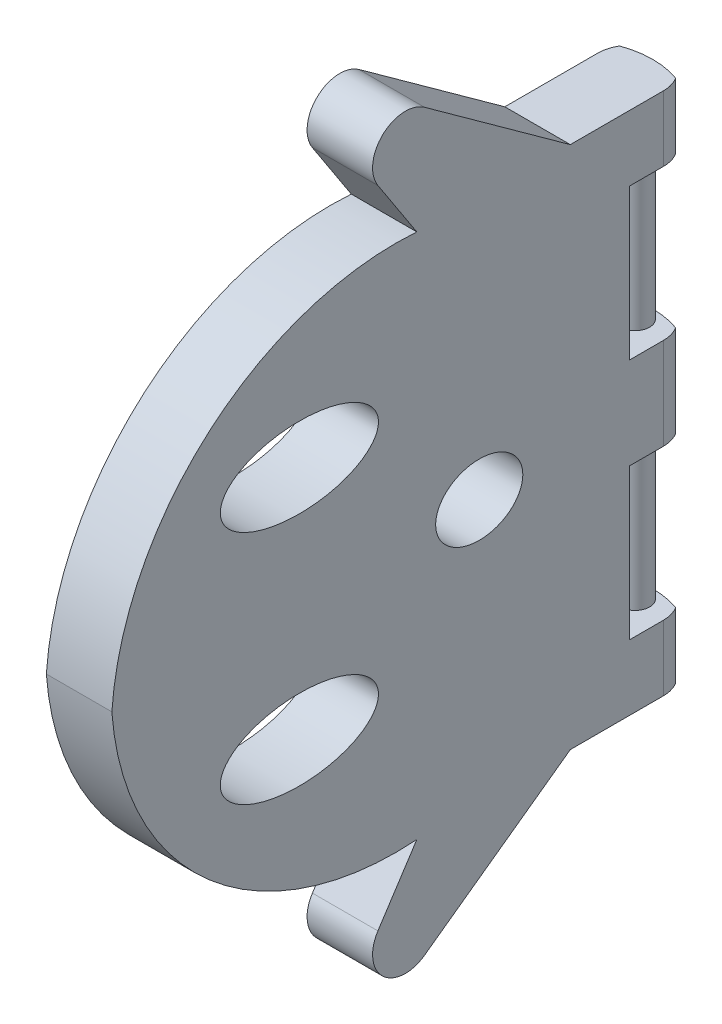
ISO-10303-21;
HEADER;
FILE_DESCRIPTION(('STEP AP214'),'2;1');
FILE_NAME('part.step','',(''),(''),'','','');
FILE_SCHEMA(('AUTOMOTIVE_DESIGN { 1 0 10303 214 1 1 1 1 }'));
ENDSEC;
DATA;
#1=APPLICATION_CONTEXT('core data for automotive mechanical design processes');
#2=APPLICATION_PROTOCOL_DEFINITION('international standard','automotive_design',2000,#1);
#3=PRODUCT_CONTEXT('',#1,'mechanical');
#4=PRODUCT('Part','Part','',(#3));
#5=PRODUCT_RELATED_PRODUCT_CATEGORY('part','',(#4));
#6=PRODUCT_DEFINITION_FORMATION('','',#4);
#7=PRODUCT_DEFINITION_CONTEXT('part definition',#1,'design');
#8=PRODUCT_DEFINITION('design','',#6,#7);
#9=PRODUCT_DEFINITION_SHAPE('','',#8);
#10=(LENGTH_UNIT() NAMED_UNIT(*) SI_UNIT(.MILLI.,.METRE.));
#11=(NAMED_UNIT(*) PLANE_ANGLE_UNIT() SI_UNIT($,.RADIAN.));
#12=(NAMED_UNIT(*) SI_UNIT($,.STERADIAN.) SOLID_ANGLE_UNIT());
#13=UNCERTAINTY_MEASURE_WITH_UNIT(LENGTH_MEASURE(1.E-05),#10,'distance_accuracy_value','');
#14=(GEOMETRIC_REPRESENTATION_CONTEXT(3) GLOBAL_UNCERTAINTY_ASSIGNED_CONTEXT((#13)) GLOBAL_UNIT_ASSIGNED_CONTEXT((#10,
#11,#12)) REPRESENTATION_CONTEXT('',''));
#15=CARTESIAN_POINT('',(0.,0.,0.));
#16=DIRECTION('',(0.,0.,1.));
#17=DIRECTION('',(1.,0.,0.));
#18=AXIS2_PLACEMENT_3D('',#15,#16,#17);
#19=CARTESIAN_POINT('',(5.,20.,-10.));
#20=DIRECTION('',(0.,-1.,0.));
#21=DIRECTION('',(0.,0.,-1.));
#22=AXIS2_PLACEMENT_3D('',#19,#20,#21);
#23=PLANE('',#22);
#24=CARTESIAN_POINT('',(2.5,20.,-7.10203344815805));
#25=DIRECTION('',(0.,-1.,0.));
#26=DIRECTION('',(0.,0.,-1.));
#27=AXIS2_PLACEMENT_3D('',#24,#25,#26);
#28=CIRCLE('',#27,2.5);
#29=CARTESIAN_POINT('',(5.,20.,-7.10203344815805));
#30=VERTEX_POINT('',#29);
#31=CARTESIAN_POINT('',(4.62958142106939,20.,-8.4115688509006));
#32=VERTEX_POINT('',#31);
#33=EDGE_CURVE('E483',#30,#32,#28,.F.);
#34=ORIENTED_EDGE('',*,*,#33,.T.);
#35=CARTESIAN_POINT('',(2.5112638236308,20.,-2.53424752647545));
#36=DIRECTION('',(0.,-1.,0.));
#37=DIRECTION('',(0.,0.,-1.));
#38=AXIS2_PLACEMENT_3D('',#35,#36,#37);
#39=CIRCLE('',#38,6.24741349633275);
#40=CARTESIAN_POINT('',(0.363986081439822,20.,-8.40105020698651));
#41=VERTEX_POINT('',#40);
#42=EDGE_CURVE('E267',#32,#41,#39,.F.);
#43=ORIENTED_EDGE('',*,*,#42,.T.);
#44=CARTESIAN_POINT('',(2.5,20.,-7.10203344815805));
#45=DIRECTION('',(0.,-1.,0.));
#46=DIRECTION('',(0.,0.,-1.));
#47=AXIS2_PLACEMENT_3D('',#44,#45,#46);
#48=CIRCLE('',#47,2.5);
#49=CARTESIAN_POINT('',(0.,20.,-7.10203344815805));
#50=VERTEX_POINT('',#49);
#51=EDGE_CURVE('E487',#41,#50,#48,.F.);
#52=ORIENTED_EDGE('',*,*,#51,.T.);
#53=DIRECTION('',(0.,0.,1.));
#54=VECTOR('',#53,1.);
#55=CARTESIAN_POINT('',(0.,20.,-10.));
#56=LINE('',#55,#54);
#57=CARTESIAN_POINT('',(0.,20.,0.));
#58=VERTEX_POINT('',#57);
#59=EDGE_CURVE('E311',#50,#58,#56,.T.);
#60=ORIENTED_EDGE('',*,*,#59,.T.);
#61=DIRECTION('',(-1.,0.,0.));
#62=VECTOR('',#61,1.);
#63=CARTESIAN_POINT('',(5.,20.,0.));
#64=LINE('',#63,#62);
#65=CARTESIAN_POINT('',(5.,20.,0.));
#66=VERTEX_POINT('',#65);
#67=EDGE_CURVE('E463',#66,#58,#64,.T.);
#68=ORIENTED_EDGE('',*,*,#67,.F.);
#69=DIRECTION('',(0.,0.,1.));
#70=VECTOR('',#69,1.);
#71=CARTESIAN_POINT('',(5.,20.,-10.));
#72=LINE('',#71,#70);
#73=EDGE_CURVE('E314',#30,#66,#72,.T.);
#74=ORIENTED_EDGE('',*,*,#73,.F.);
#75=EDGE_LOOP('',(#34,#43,#52,#60,#68,#74));
#76=FACE_BOUND('',#75,.T.);
#77=ADVANCED_FACE('F44',(#76),#23,.F.);
#78=CARTESIAN_POINT('',(5.,-20.,0.));
#79=DIRECTION('',(0.,1.,0.));
#80=DIRECTION('',(0.,0.,1.));
#81=AXIS2_PLACEMENT_3D('',#78,#79,#80);
#82=PLANE('',#81);
#83=CARTESIAN_POINT('',(2.5,-20.,-7.10203344815805));
#84=DIRECTION('',(0.,1.,0.));
#85=DIRECTION('',(0.,0.,1.));
#86=AXIS2_PLACEMENT_3D('',#83,#84,#85);
#87=CIRCLE('',#86,2.5);
#88=CARTESIAN_POINT('',(0.,-20.,-7.10203344815805));
#89=VERTEX_POINT('',#88);
#90=CARTESIAN_POINT('',(0.363986081439822,-20.,-8.40105020698651));
#91=VERTEX_POINT('',#90);
#92=EDGE_CURVE('E519',#89,#91,#87,.F.);
#93=ORIENTED_EDGE('',*,*,#92,.T.);
#94=CARTESIAN_POINT('',(2.5112638236308,-20.,-2.53424752647545));
#95=DIRECTION('',(0.,1.,0.));
#96=DIRECTION('',(0.,0.,1.));
#97=AXIS2_PLACEMENT_3D('',#94,#95,#96);
#98=CIRCLE('',#97,6.24741349633275);
#99=CARTESIAN_POINT('',(4.62958142106939,-20.,-8.4115688509006));
#100=VERTEX_POINT('',#99);
#101=EDGE_CURVE('E232',#91,#100,#98,.F.);
#102=ORIENTED_EDGE('',*,*,#101,.T.);
#103=CARTESIAN_POINT('',(2.5,-20.,-7.10203344815805));
#104=DIRECTION('',(0.,1.,0.));
#105=DIRECTION('',(0.,0.,1.));
#106=AXIS2_PLACEMENT_3D('',#103,#104,#105);
#107=CIRCLE('',#106,2.5);
#108=CARTESIAN_POINT('',(5.,-20.,-7.10203344815805));
#109=VERTEX_POINT('',#108);
#110=EDGE_CURVE('E514',#100,#109,#107,.F.);
#111=ORIENTED_EDGE('',*,*,#110,.T.);
#112=DIRECTION('',(0.,0.,-1.));
#113=VECTOR('',#112,1.);
#114=CARTESIAN_POINT('',(5.,-20.,0.));
#115=LINE('',#114,#113);
#116=CARTESIAN_POINT('',(5.,-20.,0.));
#117=VERTEX_POINT('',#116);
#118=EDGE_CURVE('E345',#117,#109,#115,.T.);
#119=ORIENTED_EDGE('',*,*,#118,.F.);
#120=DIRECTION('',(-1.,0.,0.));
#121=VECTOR('',#120,1.);
#122=CARTESIAN_POINT('',(5.,-20.,0.));
#123=LINE('',#122,#121);
#124=CARTESIAN_POINT('',(0.,-20.,0.));
#125=VERTEX_POINT('',#124);
#126=EDGE_CURVE('E435',#117,#125,#123,.T.);
#127=ORIENTED_EDGE('',*,*,#126,.T.);
#128=DIRECTION('',(0.,0.,-1.));
#129=VECTOR('',#128,1.);
#130=CARTESIAN_POINT('',(0.,-20.,0.));
#131=LINE('',#130,#129);
#132=EDGE_CURVE('E395',#125,#89,#131,.T.);
#133=ORIENTED_EDGE('',*,*,#132,.T.);
#134=EDGE_LOOP('',(#93,#102,#111,#119,#127,#133));
#135=FACE_BOUND('',#134,.T.);
#136=ADVANCED_FACE('F537',(#135),#82,.F.);
#137=CARTESIAN_POINT('',(5.,-15.,-4.5));
#138=DIRECTION('',(0.,-1.,0.));
#139=DIRECTION('',(0.,0.,-1.));
#140=AXIS2_PLACEMENT_3D('',#137,#138,#139);
#141=PLANE('',#140);
#142=CARTESIAN_POINT('',(2.5,-15.,-7.45));
#143=DIRECTION('',(0.,-1.,0.));
#144=DIRECTION('',(0.,0.,-1.));
#145=AXIS2_PLACEMENT_3D('',#142,#143,#144);
#146=CIRCLE('',#145,1.1);
#147=CARTESIAN_POINT('',(2.5,-15.,-8.55));
#148=VERTEX_POINT('',#147);
#149=EDGE_CURVE('E53',#148,#148,#146,.F.);
#150=ORIENTED_EDGE('',*,*,#149,.F.);
#151=EDGE_LOOP('',(#150));
#152=FACE_BOUND('',#151,.T.);
#153=CARTESIAN_POINT('',(2.5,-15.,-7.10203344815805));
#154=DIRECTION('',(0.,-1.,0.));
#155=DIRECTION('',(0.,0.,-1.));
#156=AXIS2_PLACEMENT_3D('',#153,#154,#155);
#157=CIRCLE('',#156,2.5);
#158=CARTESIAN_POINT('',(5.,-15.,-7.10203344815805));
#159=VERTEX_POINT('',#158);
#160=CARTESIAN_POINT('',(4.62958142106939,-15.,-8.4115688509006));
#161=VERTEX_POINT('',#160);
#162=EDGE_CURVE('E223',#159,#161,#157,.F.);
#163=ORIENTED_EDGE('',*,*,#162,.T.);
#164=CARTESIAN_POINT('',(2.5112638236308,-15.,-2.53424752647545));
#165=DIRECTION('',(0.,-1.,0.));
#166=DIRECTION('',(0.,0.,-1.));
#167=AXIS2_PLACEMENT_3D('',#164,#165,#166);
#168=CIRCLE('',#167,6.24741349633275);
#169=CARTESIAN_POINT('',(0.363986081439822,-15.,-8.40105020698651));
#170=VERTEX_POINT('',#169);
#171=EDGE_CURVE('E226',#161,#170,#168,.F.);
#172=ORIENTED_EDGE('',*,*,#171,.T.);
#173=CARTESIAN_POINT('',(2.5,-15.,-7.10203344815805));
#174=DIRECTION('',(0.,-1.,0.));
#175=DIRECTION('',(0.,0.,-1.));
#176=AXIS2_PLACEMENT_3D('',#173,#174,#175);
#177=CIRCLE('',#176,2.5);
#178=CARTESIAN_POINT('',(0.,-15.,-7.10203344815805));
#179=VERTEX_POINT('',#178);
#180=EDGE_CURVE('E213',#170,#179,#177,.F.);
#181=ORIENTED_EDGE('',*,*,#180,.T.);
#182=DIRECTION('',(0.,0.,1.));
#183=VECTOR('',#182,1.);
#184=CARTESIAN_POINT('',(0.,-15.,-4.5));
#185=LINE('',#184,#183);
#186=CARTESIAN_POINT('',(0.,-15.,-4.5));
#187=VERTEX_POINT('',#186);
#188=EDGE_CURVE('E397',#179,#187,#185,.T.);
#189=ORIENTED_EDGE('',*,*,#188,.T.);
#190=DIRECTION('',(-1.,0.,0.));
#191=VECTOR('',#190,1.);
#192=CARTESIAN_POINT('',(5.,-15.,-4.5));
#193=LINE('',#192,#191);
#194=CARTESIAN_POINT('',(5.,-15.,-4.5));
#195=VERTEX_POINT('',#194);
#196=EDGE_CURVE('E426',#195,#187,#193,.T.);
#197=ORIENTED_EDGE('',*,*,#196,.F.);
#198=DIRECTION('',(0.,0.,1.));
#199=VECTOR('',#198,1.);
#200=CARTESIAN_POINT('',(5.,-15.,-4.5));
#201=LINE('',#200,#199);
#202=EDGE_CURVE('E349',#159,#195,#201,.T.);
#203=ORIENTED_EDGE('',*,*,#202,.F.);
#204=EDGE_LOOP('',(#163,#172,#181,#189,#197,#203));
#205=FACE_BOUND('',#204,.T.);
#206=ADVANCED_FACE('F230',(#152,#205),#141,.F.);
#207=CARTESIAN_POINT('',(5.,-3.5,-4.5));
#208=DIRECTION('',(0.,1.,0.));
#209=DIRECTION('',(0.,0.,1.));
#210=AXIS2_PLACEMENT_3D('',#207,#208,#209);
#211=PLANE('',#210);
#212=CARTESIAN_POINT('',(2.5,-3.5,-7.45));
#213=DIRECTION('',(0.,1.,0.));
#214=DIRECTION('',(0.,0.,1.));
#215=AXIS2_PLACEMENT_3D('',#212,#213,#214);
#216=CIRCLE('',#215,1.1);
#217=CARTESIAN_POINT('',(2.5,-3.5,-6.35));
#218=VERTEX_POINT('',#217);
#219=EDGE_CURVE('E527',#218,#218,#216,.F.);
#220=ORIENTED_EDGE('',*,*,#219,.F.);
#221=EDGE_LOOP('',(#220));
#222=FACE_BOUND('',#221,.T.);
#223=CARTESIAN_POINT('',(2.5,-3.5,-7.10203344815805));
#224=DIRECTION('',(0.,1.,0.));
#225=DIRECTION('',(0.,0.,1.));
#226=AXIS2_PLACEMENT_3D('',#223,#224,#225);
#227=CIRCLE('',#226,2.5);
#228=CARTESIAN_POINT('',(0.,-3.5,-7.10203344815805));
#229=VERTEX_POINT('',#228);
#230=CARTESIAN_POINT('',(0.363986081439822,-3.5,-8.40105020698651));
#231=VERTEX_POINT('',#230);
#232=EDGE_CURVE('E505',#229,#231,#227,.F.);
#233=ORIENTED_EDGE('',*,*,#232,.T.);
#234=CARTESIAN_POINT('',(2.5112638236308,-3.5,-2.53424752647545));
#235=DIRECTION('',(0.,1.,0.));
#236=DIRECTION('',(0.,0.,1.));
#237=AXIS2_PLACEMENT_3D('',#234,#235,#236);
#238=CIRCLE('',#237,6.24741349633275);
#239=CARTESIAN_POINT('',(4.62958142106939,-3.5,-8.4115688509006));
#240=VERTEX_POINT('',#239);
#241=EDGE_CURVE('E253',#231,#240,#238,.F.);
#242=ORIENTED_EDGE('',*,*,#241,.T.);
#243=CARTESIAN_POINT('',(2.5,-3.5,-7.10203344815805));
#244=DIRECTION('',(0.,1.,0.));
#245=DIRECTION('',(0.,0.,1.));
#246=AXIS2_PLACEMENT_3D('',#243,#244,#245);
#247=CIRCLE('',#246,2.5);
#248=CARTESIAN_POINT('',(5.,-3.5,-7.10203344815805));
#249=VERTEX_POINT('',#248);
#250=EDGE_CURVE('E497',#240,#249,#247,.F.);
#251=ORIENTED_EDGE('',*,*,#250,.T.);
#252=DIRECTION('',(0.,0.,-1.));
#253=VECTOR('',#252,1.);
#254=CARTESIAN_POINT('',(5.,-3.5,-4.5));
#255=LINE('',#254,#253);
#256=CARTESIAN_POINT('',(5.,-3.5,-4.5));
#257=VERTEX_POINT('',#256);
#258=EDGE_CURVE('E352',#257,#249,#255,.T.);
#259=ORIENTED_EDGE('',*,*,#258,.F.);
#260=DIRECTION('',(-1.,0.,0.));
#261=VECTOR('',#260,1.);
#262=CARTESIAN_POINT('',(5.,-3.5,-4.5));
#263=LINE('',#262,#261);
#264=CARTESIAN_POINT('',(0.,-3.5,-4.5));
#265=VERTEX_POINT('',#264);
#266=EDGE_CURVE('E425',#257,#265,#263,.T.);
#267=ORIENTED_EDGE('',*,*,#266,.T.);
#268=DIRECTION('',(0.,0.,-1.));
#269=VECTOR('',#268,1.);
#270=CARTESIAN_POINT('',(0.,-3.5,-4.5));
#271=LINE('',#270,#269);
#272=EDGE_CURVE('E404',#265,#229,#271,.T.);
#273=ORIENTED_EDGE('',*,*,#272,.T.);
#274=EDGE_LOOP('',(#233,#242,#251,#259,#267,#273));
#275=FACE_BOUND('',#274,.T.);
#276=ADVANCED_FACE('F538',(#222,#275),#211,.F.);
#277=CARTESIAN_POINT('',(5.,3.5,-10.));
#278=DIRECTION('',(0.,-1.,0.));
#279=DIRECTION('',(0.,0.,-1.));
#280=AXIS2_PLACEMENT_3D('',#277,#278,#279);
#281=PLANE('',#280);
#282=CARTESIAN_POINT('',(2.5,3.5,-7.45));
#283=DIRECTION('',(0.,-1.,0.));
#284=DIRECTION('',(0.,0.,-1.));
#285=AXIS2_PLACEMENT_3D('',#282,#283,#284);
#286=CIRCLE('',#285,1.1);
#287=CARTESIAN_POINT('',(2.5,3.5,-8.55));
#288=VERTEX_POINT('',#287);
#289=EDGE_CURVE('E525',#288,#288,#286,.F.);
#290=ORIENTED_EDGE('',*,*,#289,.F.);
#291=EDGE_LOOP('',(#290));
#292=FACE_BOUND('',#291,.T.);
#293=CARTESIAN_POINT('',(2.5,3.5,-7.10203344815805));
#294=DIRECTION('',(0.,-1.,0.));
#295=DIRECTION('',(0.,0.,-1.));
#296=AXIS2_PLACEMENT_3D('',#293,#294,#295);
#297=CIRCLE('',#296,2.5);
#298=CARTESIAN_POINT('',(5.,3.5,-7.10203344815805));
#299=VERTEX_POINT('',#298);
#300=CARTESIAN_POINT('',(4.62958142106939,3.5,-8.4115688509006));
#301=VERTEX_POINT('',#300);
#302=EDGE_CURVE('E506',#299,#301,#297,.F.);
#303=ORIENTED_EDGE('',*,*,#302,.T.);
#304=CARTESIAN_POINT('',(2.5112638236308,3.5,-2.53424752647545));
#305=DIRECTION('',(0.,-1.,0.));
#306=DIRECTION('',(0.,0.,-1.));
#307=AXIS2_PLACEMENT_3D('',#304,#305,#306);
#308=CIRCLE('',#307,6.24741349633275);
#309=CARTESIAN_POINT('',(0.363986081439822,3.5,-8.40105020698651));
#310=VERTEX_POINT('',#309);
#311=EDGE_CURVE('E252',#301,#310,#308,.F.);
#312=ORIENTED_EDGE('',*,*,#311,.T.);
#313=CARTESIAN_POINT('',(2.5,3.5,-7.10203344815805));
#314=DIRECTION('',(0.,-1.,0.));
#315=DIRECTION('',(0.,0.,-1.));
#316=AXIS2_PLACEMENT_3D('',#313,#314,#315);
#317=CIRCLE('',#316,2.5);
#318=CARTESIAN_POINT('',(0.,3.5,-7.10203344815805));
#319=VERTEX_POINT('',#318);
#320=EDGE_CURVE('E509',#310,#319,#317,.F.);
#321=ORIENTED_EDGE('',*,*,#320,.T.);
#322=DIRECTION('',(0.,0.,1.));
#323=VECTOR('',#322,1.);
#324=CARTESIAN_POINT('',(0.,3.5,-10.));
#325=LINE('',#324,#323);
#326=CARTESIAN_POINT('',(0.,3.5,-4.5));
#327=VERTEX_POINT('',#326);
#328=EDGE_CURVE('E410',#319,#327,#325,.T.);
#329=ORIENTED_EDGE('',*,*,#328,.T.);
#330=DIRECTION('',(-1.,0.,0.));
#331=VECTOR('',#330,1.);
#332=CARTESIAN_POINT('',(5.,3.5,-4.5));
#333=LINE('',#332,#331);
#334=CARTESIAN_POINT('',(5.,3.5,-4.5));
#335=VERTEX_POINT('',#334);
#336=EDGE_CURVE('E419',#335,#327,#333,.T.);
#337=ORIENTED_EDGE('',*,*,#336,.F.);
#338=DIRECTION('',(0.,0.,1.));
#339=VECTOR('',#338,1.);
#340=CARTESIAN_POINT('',(5.,3.5,-10.));
#341=LINE('',#340,#339);
#342=EDGE_CURVE('E357',#299,#335,#341,.T.);
#343=ORIENTED_EDGE('',*,*,#342,.F.);
#344=EDGE_LOOP('',(#303,#312,#321,#329,#337,#343));
#345=FACE_BOUND('',#344,.T.);
#346=ADVANCED_FACE('F546',(#292,#345),#281,.F.);
#347=CARTESIAN_POINT('',(5.,15.,-4.5));
#348=DIRECTION('',(0.,1.,0.));
#349=DIRECTION('',(0.,0.,1.));
#350=AXIS2_PLACEMENT_3D('',#347,#348,#349);
#351=PLANE('',#350);
#352=CARTESIAN_POINT('',(2.5,15.,-7.45));
#353=DIRECTION('',(0.,1.,0.));
#354=DIRECTION('',(0.,0.,1.));
#355=AXIS2_PLACEMENT_3D('',#352,#353,#354);
#356=CIRCLE('',#355,1.1);
#357=CARTESIAN_POINT('',(2.5,15.,-6.35));
#358=VERTEX_POINT('',#357);
#359=EDGE_CURVE('E222',#358,#358,#356,.F.);
#360=ORIENTED_EDGE('',*,*,#359,.F.);
#361=EDGE_LOOP('',(#360));
#362=FACE_BOUND('',#361,.T.);
#363=CARTESIAN_POINT('',(2.5,15.,-7.10203344815805));
#364=DIRECTION('',(0.,1.,0.));
#365=DIRECTION('',(0.,0.,1.));
#366=AXIS2_PLACEMENT_3D('',#363,#364,#365);
#367=CIRCLE('',#366,2.5);
#368=CARTESIAN_POINT('',(0.,15.,-7.10203344815805));
#369=VERTEX_POINT('',#368);
#370=CARTESIAN_POINT('',(0.363986081439822,15.,-8.40105020698651));
#371=VERTEX_POINT('',#370);
#372=EDGE_CURVE('E481',#369,#371,#367,.F.);
#373=ORIENTED_EDGE('',*,*,#372,.T.);
#374=CARTESIAN_POINT('',(2.5112638236308,15.,-2.53424752647545));
#375=DIRECTION('',(0.,1.,0.));
#376=DIRECTION('',(0.,0.,1.));
#377=AXIS2_PLACEMENT_3D('',#374,#375,#376);
#378=CIRCLE('',#377,6.24741349633275);
#379=CARTESIAN_POINT('',(4.62958142106939,15.,-8.4115688509006));
#380=VERTEX_POINT('',#379);
#381=EDGE_CURVE('E64',#371,#380,#378,.F.);
#382=ORIENTED_EDGE('',*,*,#381,.T.);
#383=CARTESIAN_POINT('',(2.5,15.,-7.10203344815805));
#384=DIRECTION('',(0.,1.,0.));
#385=DIRECTION('',(0.,0.,1.));
#386=AXIS2_PLACEMENT_3D('',#383,#384,#385);
#387=CIRCLE('',#386,2.5);
#388=CARTESIAN_POINT('',(5.,15.,-7.10203344815805));
#389=VERTEX_POINT('',#388);
#390=EDGE_CURVE('E477',#380,#389,#387,.F.);
#391=ORIENTED_EDGE('',*,*,#390,.T.);
#392=DIRECTION('',(0.,0.,-1.));
#393=VECTOR('',#392,1.);
#394=CARTESIAN_POINT('',(5.,15.,-4.5));
#395=LINE('',#394,#393);
#396=CARTESIAN_POINT('',(5.,15.,-4.5));
#397=VERTEX_POINT('',#396);
#398=EDGE_CURVE('E361',#397,#389,#395,.T.);
#399=ORIENTED_EDGE('',*,*,#398,.F.);
#400=DIRECTION('',(-1.,0.,0.));
#401=VECTOR('',#400,1.);
#402=CARTESIAN_POINT('',(5.,15.,-4.5));
#403=LINE('',#402,#401);
#404=CARTESIAN_POINT('',(0.,15.,-4.5));
#405=VERTEX_POINT('',#404);
#406=EDGE_CURVE('E370',#397,#405,#403,.T.);
#407=ORIENTED_EDGE('',*,*,#406,.T.);
#408=DIRECTION('',(0.,0.,-1.));
#409=VECTOR('',#408,1.);
#410=CARTESIAN_POINT('',(0.,15.,-4.5));
#411=LINE('',#410,#409);
#412=EDGE_CURVE('E316',#405,#369,#411,.T.);
#413=ORIENTED_EDGE('',*,*,#412,.T.);
#414=EDGE_LOOP('',(#373,#382,#391,#399,#407,#413));
#415=FACE_BOUND('',#414,.T.);
#416=ADVANCED_FACE('F634',(#362,#415),#351,.F.);
#417=CARTESIAN_POINT('',(5.,26.0072078608451,12.5950864366068));
#418=DIRECTION('',(-1.,0.,0.));
#419=DIRECTION('',(0.,0.,1.));
#420=AXIS2_PLACEMENT_3D('',#417,#418,#419);
#421=PLANE('',#420);
#422=CARTESIAN_POINT('',(5.,8.99716124988552,20.6852255802241));
#423=DIRECTION('',(1.,0.,0.));
#424=DIRECTION('',(0.,0.,1.));
#425=AXIS2_PLACEMENT_3D('',#422,#423,#424);
#426=ELLIPSE('',#425,6.03652616168739,3.07053946295394);
#427=CARTESIAN_POINT('',(5.,8.99716124988552,26.7217517419115));
#428=VERTEX_POINT('',#427);
#429=EDGE_CURVE('E273',#428,#428,#426,.T.);
#430=ORIENTED_EDGE('',*,*,#429,.F.);
#431=EDGE_LOOP('',(#430));
#432=FACE_BOUND('',#431,.T.);
#433=CARTESIAN_POINT('',(5.,0.,6.95309075979127));
#434=DIRECTION('',(1.,0.,0.));
#435=DIRECTION('',(0.,0.,-1.));
#436=AXIS2_PLACEMENT_3D('',#433,#434,#435);
#437=ELLIPSE('',#436,3.32641775153342,2.68794726191138);
#438=CARTESIAN_POINT('',(5.,0.,3.62667300825784));
#439=VERTEX_POINT('',#438);
#440=EDGE_CURVE('E296',#439,#439,#437,.T.);
#441=ORIENTED_EDGE('',*,*,#440,.F.);
#442=EDGE_LOOP('',(#441));
#443=FACE_BOUND('',#442,.T.);
#444=CARTESIAN_POINT('',(5.,-8.99716124988552,20.6852255802241));
#445=DIRECTION('',(1.,0.,0.));
#446=DIRECTION('',(0.,0.,1.));
#447=AXIS2_PLACEMENT_3D('',#444,#445,#446);
#448=ELLIPSE('',#447,6.03652616168739,3.07053946295394);
#449=CARTESIAN_POINT('',(5.,-8.99716124988552,26.7217517419115));
#450=VERTEX_POINT('',#449);
#451=EDGE_CURVE('E306',#450,#450,#448,.T.);
#452=ORIENTED_EDGE('',*,*,#451,.F.);
#453=EDGE_LOOP('',(#452));
#454=FACE_BOUND('',#453,.T.);
#455=ORIENTED_EDGE('',*,*,#398,.T.);
#456=DIRECTION('',(0.,-1.,0.));
#457=VECTOR('',#456,1.);
#458=CARTESIAN_POINT('',(5.,20.,-7.10203344815805));
#459=LINE('',#458,#457);
#460=EDGE_CURVE('E496',#389,#30,#459,.F.);
#461=ORIENTED_EDGE('',*,*,#460,.T.);
#462=ORIENTED_EDGE('',*,*,#73,.T.);
#463=DIRECTION('',(0.,0.585231549761966,0.810866223962502));
#464=VECTOR('',#463,1.);
#465=CARTESIAN_POINT('',(5.,28.0343734207513,11.1320075622019));
#466=LINE('',#465,#464);
#467=CARTESIAN_POINT('',(5.,28.0343734207513,11.1320075622019));
#468=VERTEX_POINT('',#467);
#469=EDGE_CURVE('E319',#66,#468,#466,.T.);
#470=ORIENTED_EDGE('',*,*,#469,.T.);
#471=CARTESIAN_POINT('',(5.,26.0072078608451,12.5950864366068));
#472=DIRECTION('',(1.,0.,0.));
#473=DIRECTION('',(0.,0.,1.));
#474=AXIS2_PLACEMENT_3D('',#471,#472,#473);
#475=CIRCLE('',#474,2.5);
#476=CARTESIAN_POINT('',(5.,24.6416330224624,14.6891746297773));
#477=VERTEX_POINT('',#476);
#478=EDGE_CURVE('E321',#468,#477,#475,.T.);
#479=ORIENTED_EDGE('',*,*,#478,.T.);
#480=DIRECTION('',(0.,-0.83763527726821,-0.54622993535306));
#481=VECTOR('',#480,1.);
#482=CARTESIAN_POINT('',(5.,20.0846539213169,11.7175251931133));
#483=LINE('',#482,#481);
#484=CARTESIAN_POINT('',(5.,20.0846539213169,11.7175251931133));
#485=VERTEX_POINT('',#484);
#486=EDGE_CURVE('E322',#477,#485,#483,.T.);
#487=ORIENTED_EDGE('',*,*,#486,.T.);
#488=CARTESIAN_POINT('',(5.,-1.59425920913258,13.3204480280081));
#489=DIRECTION('',(1.,0.,0.));
#490=DIRECTION('',(0.,0.,1.));
#491=AXIS2_PLACEMENT_3D('',#488,#489,#490);
#492=CIRCLE('',#491,21.7380918236215);
#493=CARTESIAN_POINT('',(5.,0.,35.));
#494=VERTEX_POINT('',#493);
#495=EDGE_CURVE('E327',#485,#494,#492,.T.);
#496=ORIENTED_EDGE('',*,*,#495,.T.);
#497=CARTESIAN_POINT('',(5.,1.59425920913258,13.3204480280081));
#498=DIRECTION('',(1.,0.,0.));
#499=DIRECTION('',(0.,0.,-1.));
#500=AXIS2_PLACEMENT_3D('',#497,#498,#499);
#501=CIRCLE('',#500,21.7380918236215);
#502=CARTESIAN_POINT('',(5.,-20.0846539213169,11.7175251931133));
#503=VERTEX_POINT('',#502);
#504=EDGE_CURVE('E331',#494,#503,#501,.T.);
#505=ORIENTED_EDGE('',*,*,#504,.T.);
#506=DIRECTION('',(0.,-0.83763527726821,0.54622993535306));
#507=VECTOR('',#506,1.);
#508=CARTESIAN_POINT('',(5.,-20.0846539213169,11.7175251931133));
#509=LINE('',#508,#507);
#510=CARTESIAN_POINT('',(5.,-24.6416330224624,14.6891746297773));
#511=VERTEX_POINT('',#510);
#512=EDGE_CURVE('E333',#503,#511,#509,.T.);
#513=ORIENTED_EDGE('',*,*,#512,.T.);
#514=CARTESIAN_POINT('',(5.,-26.0072078608451,12.5950864366068));
#515=DIRECTION('',(1.,0.,0.));
#516=DIRECTION('',(0.,0.,-1.));
#517=AXIS2_PLACEMENT_3D('',#514,#515,#516);
#518=CIRCLE('',#517,2.5);
#519=CARTESIAN_POINT('',(5.,-28.0343734207513,11.1320075622019));
#520=VERTEX_POINT('',#519);
#521=EDGE_CURVE('E340',#511,#520,#518,.T.);
#522=ORIENTED_EDGE('',*,*,#521,.T.);
#523=DIRECTION('',(0.,0.585231549761966,-0.810866223962503));
#524=VECTOR('',#523,1.);
#525=CARTESIAN_POINT('',(5.,-28.0343734207513,11.1320075622019));
#526=LINE('',#525,#524);
#527=EDGE_CURVE('E338',#520,#117,#526,.T.);
#528=ORIENTED_EDGE('',*,*,#527,.T.);
#529=ORIENTED_EDGE('',*,*,#118,.T.);
#530=DIRECTION('',(0.,-1.,0.));
#531=VECTOR('',#530,1.);
#532=CARTESIAN_POINT('',(5.,-15.,-7.10203344815805));
#533=LINE('',#532,#531);
#534=EDGE_CURVE('E489',#109,#159,#533,.F.);
#535=ORIENTED_EDGE('',*,*,#534,.T.);
#536=ORIENTED_EDGE('',*,*,#202,.T.);
#537=DIRECTION('',(0.,1.,0.));
#538=VECTOR('',#537,1.);
#539=CARTESIAN_POINT('',(5.,-15.,-4.5));
#540=LINE('',#539,#538);
#541=EDGE_CURVE('E346',#195,#257,#540,.T.);
#542=ORIENTED_EDGE('',*,*,#541,.T.);
#543=ORIENTED_EDGE('',*,*,#258,.T.);
#544=DIRECTION('',(0.,-1.,0.));
#545=VECTOR('',#544,1.);
#546=CARTESIAN_POINT('',(5.,3.5,-7.10203344815805));
#547=LINE('',#546,#545);
#548=EDGE_CURVE('E491',#249,#299,#547,.F.);
#549=ORIENTED_EDGE('',*,*,#548,.T.);
#550=ORIENTED_EDGE('',*,*,#342,.T.);
#551=DIRECTION('',(0.,1.,0.));
#552=VECTOR('',#551,1.);
#553=CARTESIAN_POINT('',(5.,3.5,-4.5));
#554=LINE('',#553,#552);
#555=EDGE_CURVE('E359',#335,#397,#554,.T.);
#556=ORIENTED_EDGE('',*,*,#555,.T.);
#557=EDGE_LOOP('',(#455,#461,#462,#470,#479,#487,#496,#505,#513,#522,#528,#529,#535,#536,#542,
#543,#549,#550,#556));
#558=FACE_BOUND('',#557,.T.);
#559=ADVANCED_FACE('F589',(#432,#443,#454,#558),#421,.F.);
#560=CARTESIAN_POINT('',(0.,26.0072078608451,12.5950864366068));
#561=DIRECTION('',(-1.,0.,0.));
#562=DIRECTION('',(0.,0.,1.));
#563=AXIS2_PLACEMENT_3D('',#560,#561,#562);
#564=PLANE('',#563);
#565=CARTESIAN_POINT('',(0.,0.,6.95309075979127));
#566=DIRECTION('',(1.,0.,0.));
#567=DIRECTION('',(0.,0.,-1.));
#568=AXIS2_PLACEMENT_3D('',#565,#566,#567);
#569=ELLIPSE('',#568,3.32641775153342,2.68794726191138);
#570=CARTESIAN_POINT('',(0.,0.,3.62667300825784));
#571=VERTEX_POINT('',#570);
#572=EDGE_CURVE('E277',#571,#571,#569,.T.);
#573=ORIENTED_EDGE('',*,*,#572,.T.);
#574=EDGE_LOOP('',(#573));
#575=FACE_BOUND('',#574,.T.);
#576=CARTESIAN_POINT('',(0.,-8.99716124988552,20.6852255802241));
#577=DIRECTION('',(1.,0.,0.));
#578=DIRECTION('',(0.,0.,1.));
#579=AXIS2_PLACEMENT_3D('',#576,#577,#578);
#580=ELLIPSE('',#579,6.03652616168739,3.07053946295394);
#581=CARTESIAN_POINT('',(0.,-8.99716124988552,26.7217517419115));
#582=VERTEX_POINT('',#581);
#583=EDGE_CURVE('E303',#582,#582,#580,.T.);
#584=ORIENTED_EDGE('',*,*,#583,.T.);
#585=EDGE_LOOP('',(#584));
#586=FACE_BOUND('',#585,.T.);
#587=CARTESIAN_POINT('',(0.,8.99716124988552,20.6852255802241));
#588=DIRECTION('',(1.,0.,0.));
#589=DIRECTION('',(0.,0.,1.));
#590=AXIS2_PLACEMENT_3D('',#587,#588,#589);
#591=ELLIPSE('',#590,6.03652616168739,3.07053946295394);
#592=CARTESIAN_POINT('',(0.,8.99716124988552,26.7217517419115));
#593=VERTEX_POINT('',#592);
#594=EDGE_CURVE('E274',#593,#593,#591,.T.);
#595=ORIENTED_EDGE('',*,*,#594,.T.);
#596=EDGE_LOOP('',(#595));
#597=FACE_BOUND('',#596,.T.);
#598=ORIENTED_EDGE('',*,*,#59,.F.);
#599=DIRECTION('',(0.,-1.,0.));
#600=VECTOR('',#599,1.);
#601=CARTESIAN_POINT('',(0.,26.0072078608451,-7.10203344815805));
#602=LINE('',#601,#600);
#603=EDGE_CURVE('E473',#50,#369,#602,.T.);
#604=ORIENTED_EDGE('',*,*,#603,.T.);
#605=ORIENTED_EDGE('',*,*,#412,.F.);
#606=DIRECTION('',(0.,1.,0.));
#607=VECTOR('',#606,1.);
#608=CARTESIAN_POINT('',(0.,3.5,-4.5));
#609=LINE('',#608,#607);
#610=EDGE_CURVE('E413',#327,#405,#609,.T.);
#611=ORIENTED_EDGE('',*,*,#610,.F.);
#612=ORIENTED_EDGE('',*,*,#328,.F.);
#613=DIRECTION('',(0.,-1.,0.));
#614=VECTOR('',#613,1.);
#615=CARTESIAN_POINT('',(0.,26.0072078608451,-7.10203344815805));
#616=LINE('',#615,#614);
#617=EDGE_CURVE('E468',#319,#229,#616,.T.);
#618=ORIENTED_EDGE('',*,*,#617,.T.);
#619=ORIENTED_EDGE('',*,*,#272,.F.);
#620=DIRECTION('',(0.,1.,0.));
#621=VECTOR('',#620,1.);
#622=CARTESIAN_POINT('',(0.,-15.,-4.5));
#623=LINE('',#622,#621);
#624=EDGE_CURVE('E402',#187,#265,#623,.T.);
#625=ORIENTED_EDGE('',*,*,#624,.F.);
#626=ORIENTED_EDGE('',*,*,#188,.F.);
#627=DIRECTION('',(0.,-1.,0.));
#628=VECTOR('',#627,1.);
#629=CARTESIAN_POINT('',(0.,26.0072078608451,-7.10203344815805));
#630=LINE('',#629,#628);
#631=EDGE_CURVE('E220',#179,#89,#630,.T.);
#632=ORIENTED_EDGE('',*,*,#631,.T.);
#633=ORIENTED_EDGE('',*,*,#132,.F.);
#634=DIRECTION('',(0.,0.585231549761966,-0.810866223962503));
#635=VECTOR('',#634,1.);
#636=CARTESIAN_POINT('',(0.,-28.0343734207513,11.1320075622019));
#637=LINE('',#636,#635);
#638=CARTESIAN_POINT('',(0.,-28.0343734207513,11.1320075622019));
#639=VERTEX_POINT('',#638);
#640=EDGE_CURVE('E393',#639,#125,#637,.T.);
#641=ORIENTED_EDGE('',*,*,#640,.F.);
#642=CARTESIAN_POINT('',(0.,-26.0072078608451,12.5950864366068));
#643=DIRECTION('',(1.,0.,0.));
#644=DIRECTION('',(0.,0.,-1.));
#645=AXIS2_PLACEMENT_3D('',#642,#643,#644);
#646=CIRCLE('',#645,2.5);
#647=CARTESIAN_POINT('',(0.,-24.6416330224624,14.6891746297773));
#648=VERTEX_POINT('',#647);
#649=EDGE_CURVE('E390',#648,#639,#646,.T.);
#650=ORIENTED_EDGE('',*,*,#649,.F.);
#651=DIRECTION('',(0.,-0.83763527726821,0.54622993535306));
#652=VECTOR('',#651,1.);
#653=CARTESIAN_POINT('',(0.,-20.0846539213169,11.7175251931133));
#654=LINE('',#653,#652);
#655=CARTESIAN_POINT('',(0.,-20.0846539213169,11.7175251931133));
#656=VERTEX_POINT('',#655);
#657=EDGE_CURVE('E383',#656,#648,#654,.T.);
#658=ORIENTED_EDGE('',*,*,#657,.F.);
#659=CARTESIAN_POINT('',(0.,1.59425920913258,13.3204480280081));
#660=DIRECTION('',(1.,0.,0.));
#661=DIRECTION('',(0.,0.,-1.));
#662=AXIS2_PLACEMENT_3D('',#659,#660,#661);
#663=CIRCLE('',#662,21.7380918236215);
#664=CARTESIAN_POINT('',(0.,0.,35.));
#665=VERTEX_POINT('',#664);
#666=EDGE_CURVE('E385',#665,#656,#663,.T.);
#667=ORIENTED_EDGE('',*,*,#666,.F.);
#668=CARTESIAN_POINT('',(0.,-1.59425920913258,13.3204480280081));
#669=DIRECTION('',(1.,0.,0.));
#670=DIRECTION('',(0.,0.,1.));
#671=AXIS2_PLACEMENT_3D('',#668,#669,#670);
#672=CIRCLE('',#671,21.7380918236215);
#673=CARTESIAN_POINT('',(0.,20.0846539213169,11.7175251931133));
#674=VERTEX_POINT('',#673);
#675=EDGE_CURVE('E378',#674,#665,#672,.T.);
#676=ORIENTED_EDGE('',*,*,#675,.F.);
#677=DIRECTION('',(0.,-0.83763527726821,-0.54622993535306));
#678=VECTOR('',#677,1.);
#679=CARTESIAN_POINT('',(0.,20.0846539213169,11.7175251931133));
#680=LINE('',#679,#678);
#681=CARTESIAN_POINT('',(0.,24.6416330224624,14.6891746297773));
#682=VERTEX_POINT('',#681);
#683=EDGE_CURVE('E376',#682,#674,#680,.T.);
#684=ORIENTED_EDGE('',*,*,#683,.F.);
#685=CARTESIAN_POINT('',(0.,26.0072078608451,12.5950864366068));
#686=DIRECTION('',(1.,0.,0.));
#687=DIRECTION('',(0.,0.,1.));
#688=AXIS2_PLACEMENT_3D('',#685,#686,#687);
#689=CIRCLE('',#688,2.5);
#690=CARTESIAN_POINT('',(0.,28.0343734207513,11.1320075622019));
#691=VERTEX_POINT('',#690);
#692=EDGE_CURVE('E373',#691,#682,#689,.T.);
#693=ORIENTED_EDGE('',*,*,#692,.F.);
#694=DIRECTION('',(0.,0.585231549761966,0.810866223962502));
#695=VECTOR('',#694,1.);
#696=CARTESIAN_POINT('',(0.,28.0343734207513,11.1320075622019));
#697=LINE('',#696,#695);
#698=EDGE_CURVE('E369',#58,#691,#697,.T.);
#699=ORIENTED_EDGE('',*,*,#698,.F.);
#700=EDGE_LOOP('',(#598,#604,#605,#611,#612,#618,#619,#625,#626,#632,#633,#641,#650,#658,#667,
#676,#684,#693,#699));
#701=FACE_BOUND('',#700,.T.);
#702=ADVANCED_FACE('F596',(#575,#586,#597,#701),#564,.T.);
#703=CARTESIAN_POINT('',(5.,28.0343734207513,11.1320075622019));
#704=DIRECTION('',(0.,-0.810866223962502,0.585231549761966));
#705=DIRECTION('',(0.,-0.585231549761966,-0.810866223962502));
#706=AXIS2_PLACEMENT_3D('',#703,#704,#705);
#707=PLANE('',#706);
#708=ORIENTED_EDGE('',*,*,#698,.T.);
#709=DIRECTION('',(-1.,0.,0.));
#710=VECTOR('',#709,1.);
#711=CARTESIAN_POINT('',(5.,28.0343734207513,11.1320075622019));
#712=LINE('',#711,#710);
#713=EDGE_CURVE('E456',#468,#691,#712,.T.);
#714=ORIENTED_EDGE('',*,*,#713,.F.);
#715=ORIENTED_EDGE('',*,*,#469,.F.);
#716=ORIENTED_EDGE('',*,*,#67,.T.);
#717=EDGE_LOOP('',(#708,#714,#715,#716));
#718=FACE_BOUND('',#717,.T.);
#719=ADVANCED_FACE('F559',(#718),#707,.F.);
#720=CARTESIAN_POINT('',(5.,26.0072078608451,12.5950864366068));
#721=DIRECTION('',(-1.,0.,0.));
#722=DIRECTION('',(0.,0.,1.));
#723=AXIS2_PLACEMENT_3D('',#720,#721,#722);
#724=CYLINDRICAL_SURFACE('',#723,2.5);
#725=ORIENTED_EDGE('',*,*,#692,.T.);
#726=DIRECTION('',(-1.,0.,0.));
#727=VECTOR('',#726,1.);
#728=CARTESIAN_POINT('',(5.,24.6416330224624,14.6891746297773));
#729=LINE('',#728,#727);
#730=EDGE_CURVE('E458',#477,#682,#729,.T.);
#731=ORIENTED_EDGE('',*,*,#730,.F.);
#732=ORIENTED_EDGE('',*,*,#478,.F.);
#733=ORIENTED_EDGE('',*,*,#713,.T.);
#734=EDGE_LOOP('',(#725,#731,#732,#733));
#735=FACE_BOUND('',#734,.T.);
#736=ADVANCED_FACE('F649',(#735),#724,.T.);
#737=CARTESIAN_POINT('',(5.,20.0846539213169,11.7175251931133));
#738=DIRECTION('',(0.,0.54622993535306,-0.83763527726821));
#739=DIRECTION('',(0.,0.83763527726821,0.54622993535306));
#740=AXIS2_PLACEMENT_3D('',#737,#738,#739);
#741=PLANE('',#740);
#742=ORIENTED_EDGE('',*,*,#683,.T.);
#743=DIRECTION('',(-1.,0.,0.));
#744=VECTOR('',#743,1.);
#745=CARTESIAN_POINT('',(5.,20.0846539213169,11.7175251931133));
#746=LINE('',#745,#744);
#747=EDGE_CURVE('E451',#485,#674,#746,.T.);
#748=ORIENTED_EDGE('',*,*,#747,.F.);
#749=ORIENTED_EDGE('',*,*,#486,.F.);
#750=ORIENTED_EDGE('',*,*,#730,.T.);
#751=EDGE_LOOP('',(#742,#748,#749,#750));
#752=FACE_BOUND('',#751,.T.);
#753=ADVANCED_FACE('F648',(#752),#741,.F.);
#754=CARTESIAN_POINT('',(5.,-1.59425920913258,13.3204480280081));
#755=DIRECTION('',(-1.,0.,0.));
#756=DIRECTION('',(0.,0.,1.));
#757=AXIS2_PLACEMENT_3D('',#754,#755,#756);
#758=CYLINDRICAL_SURFACE('',#757,21.7380918236215);
#759=ORIENTED_EDGE('',*,*,#675,.T.);
#760=DIRECTION('',(-1.,0.,0.));
#761=VECTOR('',#760,1.);
#762=CARTESIAN_POINT('',(5.,0.,35.));
#763=LINE('',#762,#761);
#764=EDGE_CURVE('E449',#494,#665,#763,.T.);
#765=ORIENTED_EDGE('',*,*,#764,.F.);
#766=ORIENTED_EDGE('',*,*,#495,.F.);
#767=ORIENTED_EDGE('',*,*,#747,.T.);
#768=EDGE_LOOP('',(#759,#765,#766,#767));
#769=FACE_BOUND('',#768,.T.);
#770=ADVANCED_FACE('F655',(#769),#758,.T.);
#771=CARTESIAN_POINT('',(5.,1.59425920913258,13.3204480280081));
#772=DIRECTION('',(-1.,0.,0.));
#773=DIRECTION('',(0.,0.,1.));
#774=AXIS2_PLACEMENT_3D('',#771,#772,#773);
#775=CYLINDRICAL_SURFACE('',#774,21.7380918236215);
#776=ORIENTED_EDGE('',*,*,#666,.T.);
#777=DIRECTION('',(-1.,0.,0.));
#778=VECTOR('',#777,1.);
#779=CARTESIAN_POINT('',(5.,-20.0846539213169,11.7175251931133));
#780=LINE('',#779,#778);
#781=EDGE_CURVE('E443',#503,#656,#780,.T.);
#782=ORIENTED_EDGE('',*,*,#781,.F.);
#783=ORIENTED_EDGE('',*,*,#504,.F.);
#784=ORIENTED_EDGE('',*,*,#764,.T.);
#785=EDGE_LOOP('',(#776,#782,#783,#784));
#786=FACE_BOUND('',#785,.T.);
#787=ADVANCED_FACE('F659',(#786),#775,.T.);
#788=CARTESIAN_POINT('',(5.,-20.0846539213169,11.7175251931133));
#789=DIRECTION('',(0.,-0.54622993535306,-0.83763527726821));
#790=DIRECTION('',(0.,0.83763527726821,-0.54622993535306));
#791=AXIS2_PLACEMENT_3D('',#788,#789,#790);
#792=PLANE('',#791);
#793=ORIENTED_EDGE('',*,*,#657,.T.);
#794=DIRECTION('',(-1.,0.,0.));
#795=VECTOR('',#794,1.);
#796=CARTESIAN_POINT('',(5.,-24.6416330224624,14.6891746297773));
#797=LINE('',#796,#795);
#798=EDGE_CURVE('E439',#511,#648,#797,.T.);
#799=ORIENTED_EDGE('',*,*,#798,.F.);
#800=ORIENTED_EDGE('',*,*,#512,.F.);
#801=ORIENTED_EDGE('',*,*,#781,.T.);
#802=EDGE_LOOP('',(#793,#799,#800,#801));
#803=FACE_BOUND('',#802,.T.);
#804=ADVANCED_FACE('F664',(#803),#792,.F.);
#805=CARTESIAN_POINT('',(5.,-26.0072078608451,12.5950864366068));
#806=DIRECTION('',(-1.,0.,0.));
#807=DIRECTION('',(0.,0.,1.));
#808=AXIS2_PLACEMENT_3D('',#805,#806,#807);
#809=CYLINDRICAL_SURFACE('',#808,2.5);
#810=ORIENTED_EDGE('',*,*,#649,.T.);
#811=DIRECTION('',(-1.,0.,0.));
#812=VECTOR('',#811,1.);
#813=CARTESIAN_POINT('',(5.,-28.0343734207513,11.1320075622019));
#814=LINE('',#813,#812);
#815=EDGE_CURVE('E436',#520,#639,#814,.T.);
#816=ORIENTED_EDGE('',*,*,#815,.F.);
#817=ORIENTED_EDGE('',*,*,#521,.F.);
#818=ORIENTED_EDGE('',*,*,#798,.T.);
#819=EDGE_LOOP('',(#810,#816,#817,#818));
#820=FACE_BOUND('',#819,.T.);
#821=ADVANCED_FACE('F669',(#820),#809,.T.);
#822=CARTESIAN_POINT('',(5.,-28.0343734207513,11.1320075622019));
#823=DIRECTION('',(0.,0.810866223962503,0.585231549761966));
#824=DIRECTION('',(0.,-0.585231549761966,0.810866223962503));
#825=AXIS2_PLACEMENT_3D('',#822,#823,#824);
#826=PLANE('',#825);
#827=ORIENTED_EDGE('',*,*,#640,.T.);
#828=ORIENTED_EDGE('',*,*,#126,.F.);
#829=ORIENTED_EDGE('',*,*,#527,.F.);
#830=ORIENTED_EDGE('',*,*,#815,.T.);
#831=EDGE_LOOP('',(#827,#828,#829,#830));
#832=FACE_BOUND('',#831,.T.);
#833=ADVANCED_FACE('F592',(#832),#826,.F.);
#834=CARTESIAN_POINT('',(5.,-15.,-4.5));
#835=DIRECTION('',(0.,0.,1.));
#836=DIRECTION('',(1.,0.,0.));
#837=AXIS2_PLACEMENT_3D('',#834,#835,#836);
#838=PLANE('',#837);
#839=ORIENTED_EDGE('',*,*,#624,.T.);
#840=ORIENTED_EDGE('',*,*,#266,.F.);
#841=ORIENTED_EDGE('',*,*,#541,.F.);
#842=ORIENTED_EDGE('',*,*,#196,.T.);
#843=EDGE_LOOP('',(#839,#840,#841,#842));
#844=FACE_BOUND('',#843,.T.);
#845=ADVANCED_FACE('F602',(#844),#838,.F.);
#846=CARTESIAN_POINT('',(5.,3.5,-4.5));
#847=DIRECTION('',(0.,0.,1.));
#848=DIRECTION('',(1.,0.,0.));
#849=AXIS2_PLACEMENT_3D('',#846,#847,#848);
#850=PLANE('',#849);
#851=ORIENTED_EDGE('',*,*,#610,.T.);
#852=ORIENTED_EDGE('',*,*,#406,.F.);
#853=ORIENTED_EDGE('',*,*,#555,.F.);
#854=ORIENTED_EDGE('',*,*,#336,.T.);
#855=EDGE_LOOP('',(#851,#852,#853,#854));
#856=FACE_BOUND('',#855,.T.);
#857=ADVANCED_FACE('F622',(#856),#850,.F.);
#858=DIRECTION('',(-1.,0.,0.));
#859=VECTOR('',#858,1.);
#860=SURFACE_OF_LINEAR_EXTRUSION('',#448,#859);
#861=ORIENTED_EDGE('',*,*,#451,.T.);
#862=EDGE_LOOP('',(#861));
#863=FACE_BOUND('',#862,.T.);
#864=ORIENTED_EDGE('',*,*,#583,.F.);
#865=EDGE_LOOP('',(#864));
#866=FACE_BOUND('',#865,.T.);
#867=ADVANCED_FACE('F295',(#863,#866),#860,.T.);
#868=DIRECTION('',(-1.,0.,0.));
#869=VECTOR('',#868,1.);
#870=SURFACE_OF_LINEAR_EXTRUSION('',#437,#869);
#871=ORIENTED_EDGE('',*,*,#440,.T.);
#872=EDGE_LOOP('',(#871));
#873=FACE_BOUND('',#872,.T.);
#874=ORIENTED_EDGE('',*,*,#572,.F.);
#875=EDGE_LOOP('',(#874));
#876=FACE_BOUND('',#875,.T.);
#877=ADVANCED_FACE('F287',(#873,#876),#870,.T.);
#878=DIRECTION('',(-1.,0.,0.));
#879=VECTOR('',#878,1.);
#880=SURFACE_OF_LINEAR_EXTRUSION('',#426,#879);
#881=ORIENTED_EDGE('',*,*,#429,.T.);
#882=EDGE_LOOP('',(#881));
#883=FACE_BOUND('',#882,.T.);
#884=ORIENTED_EDGE('',*,*,#594,.F.);
#885=EDGE_LOOP('',(#884));
#886=FACE_BOUND('',#885,.T.);
#887=ADVANCED_FACE('F282',(#883,#886),#880,.T.);
#888=CARTESIAN_POINT('',(2.5,-21.9915101095811,-7.10203344815805));
#889=DIRECTION('',(0.,1.,0.));
#890=DIRECTION('',(0.,0.,1.));
#891=AXIS2_PLACEMENT_3D('',#888,#889,#890);
#892=CYLINDRICAL_SURFACE('',#891,2.5);
#893=DIRECTION('',(0.,-1.,0.));
#894=VECTOR('',#893,1.);
#895=CARTESIAN_POINT('',(4.62958142106939,20.,-8.4115688509006));
#896=LINE('',#895,#894);
#897=EDGE_CURVE('E67',#32,#380,#896,.T.);
#898=ORIENTED_EDGE('',*,*,#897,.F.);
#899=ORIENTED_EDGE('',*,*,#33,.F.);
#900=ORIENTED_EDGE('',*,*,#460,.F.);
#901=ORIENTED_EDGE('',*,*,#390,.F.);
#902=EDGE_LOOP('',(#898,#899,#900,#901));
#903=FACE_BOUND('',#902,.T.);
#904=ADVANCED_FACE('F290',(#903),#892,.T.);
#905=CARTESIAN_POINT('',(2.5,26.0072078608451,-7.10203344815805));
#906=DIRECTION('',(0.,-1.,0.));
#907=DIRECTION('',(0.,0.,-1.));
#908=AXIS2_PLACEMENT_3D('',#905,#906,#907);
#909=CYLINDRICAL_SURFACE('',#908,2.5);
#910=DIRECTION('',(0.,-1.,0.));
#911=VECTOR('',#910,1.);
#912=CARTESIAN_POINT('',(0.363986081439822,20.,-8.40105020698651));
#913=LINE('',#912,#911);
#914=EDGE_CURVE('E264',#371,#41,#913,.F.);
#915=ORIENTED_EDGE('',*,*,#914,.F.);
#916=ORIENTED_EDGE('',*,*,#372,.F.);
#917=ORIENTED_EDGE('',*,*,#603,.F.);
#918=ORIENTED_EDGE('',*,*,#51,.F.);
#919=EDGE_LOOP('',(#915,#916,#917,#918));
#920=FACE_BOUND('',#919,.T.);
#921=ADVANCED_FACE('F561',(#920),#909,.T.);
#922=CARTESIAN_POINT('',(2.5,-21.9915101095811,-7.10203344815805));
#923=DIRECTION('',(0.,1.,0.));
#924=DIRECTION('',(0.,0.,1.));
#925=AXIS2_PLACEMENT_3D('',#922,#923,#924);
#926=CYLINDRICAL_SURFACE('',#925,2.5);
#927=DIRECTION('',(0.,-1.,0.));
#928=VECTOR('',#927,1.);
#929=CARTESIAN_POINT('',(4.62958142106939,20.,-8.4115688509006));
#930=LINE('',#929,#928);
#931=EDGE_CURVE('E260',#301,#240,#930,.T.);
#932=ORIENTED_EDGE('',*,*,#931,.F.);
#933=ORIENTED_EDGE('',*,*,#302,.F.);
#934=ORIENTED_EDGE('',*,*,#548,.F.);
#935=ORIENTED_EDGE('',*,*,#250,.F.);
#936=EDGE_LOOP('',(#932,#933,#934,#935));
#937=FACE_BOUND('',#936,.T.);
#938=ADVANCED_FACE('F562',(#937),#926,.T.);
#939=CARTESIAN_POINT('',(2.5,26.0072078608451,-7.10203344815805));
#940=DIRECTION('',(0.,-1.,0.));
#941=DIRECTION('',(0.,0.,-1.));
#942=AXIS2_PLACEMENT_3D('',#939,#940,#941);
#943=CYLINDRICAL_SURFACE('',#942,2.5);
#944=DIRECTION('',(0.,-1.,0.));
#945=VECTOR('',#944,1.);
#946=CARTESIAN_POINT('',(0.363986081439822,20.,-8.40105020698651));
#947=LINE('',#946,#945);
#948=EDGE_CURVE('E244',#231,#310,#947,.F.);
#949=ORIENTED_EDGE('',*,*,#948,.F.);
#950=ORIENTED_EDGE('',*,*,#232,.F.);
#951=ORIENTED_EDGE('',*,*,#617,.F.);
#952=ORIENTED_EDGE('',*,*,#320,.F.);
#953=EDGE_LOOP('',(#949,#950,#951,#952));
#954=FACE_BOUND('',#953,.T.);
#955=ADVANCED_FACE('F568',(#954),#943,.T.);
#956=CARTESIAN_POINT('',(2.5,-21.9915101095811,-7.10203344815805));
#957=DIRECTION('',(0.,1.,0.));
#958=DIRECTION('',(0.,0.,1.));
#959=AXIS2_PLACEMENT_3D('',#956,#957,#958);
#960=CYLINDRICAL_SURFACE('',#959,2.5);
#961=DIRECTION('',(0.,-1.,0.));
#962=VECTOR('',#961,1.);
#963=CARTESIAN_POINT('',(4.62958142106939,20.,-8.4115688509006));
#964=LINE('',#963,#962);
#965=EDGE_CURVE('E237',#161,#100,#964,.T.);
#966=ORIENTED_EDGE('',*,*,#965,.F.);
#967=ORIENTED_EDGE('',*,*,#162,.F.);
#968=ORIENTED_EDGE('',*,*,#534,.F.);
#969=ORIENTED_EDGE('',*,*,#110,.F.);
#970=EDGE_LOOP('',(#966,#967,#968,#969));
#971=FACE_BOUND('',#970,.T.);
#972=ADVANCED_FACE('F50',(#971),#960,.T.);
#973=CARTESIAN_POINT('',(2.5,26.0072078608451,-7.10203344815805));
#974=DIRECTION('',(0.,-1.,0.));
#975=DIRECTION('',(0.,0.,-1.));
#976=AXIS2_PLACEMENT_3D('',#973,#974,#975);
#977=CYLINDRICAL_SURFACE('',#976,2.5);
#978=DIRECTION('',(0.,-1.,0.));
#979=VECTOR('',#978,1.);
#980=CARTESIAN_POINT('',(0.363986081439822,20.,-8.40105020698651));
#981=LINE('',#980,#979);
#982=EDGE_CURVE('E11',#91,#170,#981,.F.);
#983=ORIENTED_EDGE('',*,*,#982,.F.);
#984=ORIENTED_EDGE('',*,*,#92,.F.);
#985=ORIENTED_EDGE('',*,*,#631,.F.);
#986=ORIENTED_EDGE('',*,*,#180,.F.);
#987=EDGE_LOOP('',(#983,#984,#985,#986));
#988=FACE_BOUND('',#987,.T.);
#989=ADVANCED_FACE('F218',(#988),#977,.T.);
#990=CARTESIAN_POINT('',(2.5,15.,-7.45));
#991=DIRECTION('',(0.,-1.,0.));
#992=DIRECTION('',(0.,0.,-1.));
#993=AXIS2_PLACEMENT_3D('',#990,#991,#992);
#994=CYLINDRICAL_SURFACE('',#993,1.1);
#995=ORIENTED_EDGE('',*,*,#359,.T.);
#996=EDGE_LOOP('',(#995));
#997=FACE_BOUND('',#996,.T.);
#998=ORIENTED_EDGE('',*,*,#289,.T.);
#999=EDGE_LOOP('',(#998));
#1000=FACE_BOUND('',#999,.T.);
#1001=ADVANCED_FACE('F289',(#997,#1000),#994,.T.);
#1002=CARTESIAN_POINT('',(2.5,-15.,-7.45));
#1003=DIRECTION('',(0.,1.,0.));
#1004=DIRECTION('',(0.,0.,1.));
#1005=AXIS2_PLACEMENT_3D('',#1002,#1003,#1004);
#1006=CYLINDRICAL_SURFACE('',#1005,1.1);
#1007=ORIENTED_EDGE('',*,*,#149,.T.);
#1008=EDGE_LOOP('',(#1007));
#1009=FACE_BOUND('',#1008,.T.);
#1010=ORIENTED_EDGE('',*,*,#219,.T.);
#1011=EDGE_LOOP('',(#1010));
#1012=FACE_BOUND('',#1011,.T.);
#1013=ADVANCED_FACE('F533',(#1009,#1012),#1006,.T.);
#1014=CARTESIAN_POINT('',(2.5112638236308,116.950270360301,-2.53424752647545));
#1015=DIRECTION('',(0.,-1.,0.));
#1016=DIRECTION('',(0.,0.,-1.));
#1017=AXIS2_PLACEMENT_3D('',#1014,#1015,#1016);
#1018=CYLINDRICAL_SURFACE('',#1017,6.24741349633275);
#1019=ORIENTED_EDGE('',*,*,#171,.F.);
#1020=ORIENTED_EDGE('',*,*,#965,.T.);
#1021=ORIENTED_EDGE('',*,*,#101,.F.);
#1022=ORIENTED_EDGE('',*,*,#982,.T.);
#1023=EDGE_LOOP('',(#1019,#1020,#1021,#1022));
#1024=FACE_BOUND('',#1023,.T.);
#1025=ADVANCED_FACE('F238',(#1024),#1018,.T.);
#1026=ORIENTED_EDGE('',*,*,#311,.F.);
#1027=ORIENTED_EDGE('',*,*,#931,.T.);
#1028=ORIENTED_EDGE('',*,*,#241,.F.);
#1029=ORIENTED_EDGE('',*,*,#948,.T.);
#1030=EDGE_LOOP('',(#1026,#1027,#1028,#1029));
#1031=FACE_BOUND('',#1030,.T.);
#1032=ADVANCED_FACE('F617',(#1031),#1018,.T.);
#1033=ORIENTED_EDGE('',*,*,#42,.F.);
#1034=ORIENTED_EDGE('',*,*,#897,.T.);
#1035=ORIENTED_EDGE('',*,*,#381,.F.);
#1036=ORIENTED_EDGE('',*,*,#914,.T.);
#1037=EDGE_LOOP('',(#1033,#1034,#1035,#1036));
#1038=FACE_BOUND('',#1037,.T.);
#1039=ADVANCED_FACE('F633',(#1038),#1018,.T.);
#1040=CLOSED_SHELL('',(#77,#136,#206,#276,#346,#416,#559,#702,#719,#736,#753,#770,#787,#804,
#821,#833,#845,#857,#867,#877,#887,#904,#921,#938,#955,#972,#989,#1001,#1013,#1025,#1032,#1039));
#1041=MANIFOLD_SOLID_BREP('B2',#1040);
#1042=ADVANCED_BREP_SHAPE_REPRESENTATION('',(#18,#1041),#14);
#1043=SHAPE_DEFINITION_REPRESENTATION(#9,#1042);
ENDSEC;
END-ISO-10303-21;
